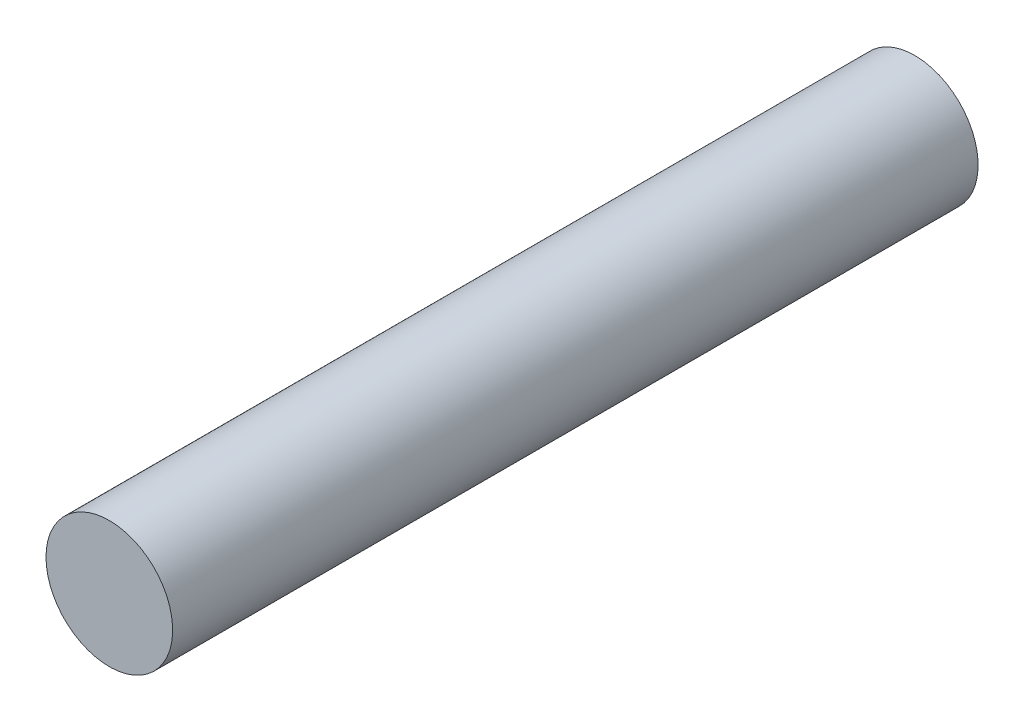
ISO-10303-21;
HEADER;
FILE_DESCRIPTION(('STEP AP214'),'2;1');
FILE_NAME('part.step','',(''),(''),'','','');
FILE_SCHEMA(('AUTOMOTIVE_DESIGN { 1 0 10303 214 1 1 1 1 }'));
ENDSEC;
DATA;
#1=APPLICATION_CONTEXT('core data for automotive mechanical design processes');
#2=APPLICATION_PROTOCOL_DEFINITION('international standard','automotive_design',2000,#1);
#3=PRODUCT_CONTEXT('',#1,'mechanical');
#4=PRODUCT('Part','Part','',(#3));
#5=PRODUCT_RELATED_PRODUCT_CATEGORY('part','',(#4));
#6=PRODUCT_DEFINITION_FORMATION('','',#4);
#7=PRODUCT_DEFINITION_CONTEXT('part definition',#1,'design');
#8=PRODUCT_DEFINITION('design','',#6,#7);
#9=PRODUCT_DEFINITION_SHAPE('','',#8);
#10=(LENGTH_UNIT() NAMED_UNIT(*) SI_UNIT(.MILLI.,.METRE.));
#11=(NAMED_UNIT(*) PLANE_ANGLE_UNIT() SI_UNIT($,.RADIAN.));
#12=(NAMED_UNIT(*) SI_UNIT($,.STERADIAN.) SOLID_ANGLE_UNIT());
#13=UNCERTAINTY_MEASURE_WITH_UNIT(LENGTH_MEASURE(1.E-05),#10,'distance_accuracy_value','');
#14=(GEOMETRIC_REPRESENTATION_CONTEXT(3) GLOBAL_UNCERTAINTY_ASSIGNED_CONTEXT((#13)) GLOBAL_UNIT_ASSIGNED_CONTEXT((#10,
#11,#12)) REPRESENTATION_CONTEXT('',''));
#15=CARTESIAN_POINT('',(0.,0.,0.));
#16=DIRECTION('',(0.,0.,1.));
#17=DIRECTION('',(1.,0.,0.));
#18=AXIS2_PLACEMENT_3D('',#15,#16,#17);
#19=CARTESIAN_POINT('',(0.,0.,159.));
#20=DIRECTION('',(0.,0.,-1.));
#21=DIRECTION('',(-1.,0.,0.));
#22=AXIS2_PLACEMENT_3D('',#19,#20,#21);
#23=CYLINDRICAL_SURFACE('',#22,12.5);
#24=CARTESIAN_POINT('',(0.,0.,159.));
#25=DIRECTION('',(0.,0.,1.));
#26=DIRECTION('',(1.,0.,0.));
#27=AXIS2_PLACEMENT_3D('',#24,#25,#26);
#28=CIRCLE('',#27,12.5);
#29=CARTESIAN_POINT('',(-12.5,0.,159.));
#30=VERTEX_POINT('',#29);
#31=EDGE_CURVE('E10',#30,#30,#28,.T.);
#32=CARTESIAN_POINT('',(0.,0.,0.));
#33=DIRECTION('',(0.,0.,1.));
#34=DIRECTION('',(1.,0.,0.));
#35=AXIS2_PLACEMENT_3D('',#32,#33,#34);
#36=CIRCLE('',#35,12.5);
#37=CARTESIAN_POINT('',(-12.5,0.,0.));
#38=VERTEX_POINT('',#37);
#39=EDGE_CURVE('E40',#38,#38,#36,.T.);
#40=CARTESIAN_POINT('',(-12.5,0.,159.));
#41=CARTESIAN_POINT('',(-12.5,0.,157.34375));
#42=CARTESIAN_POINT('',(-12.5,0.,155.6875));
#43=CARTESIAN_POINT('',(-12.5,0.,152.375));
#44=CARTESIAN_POINT('',(-12.5,0.,150.71875));
#45=CARTESIAN_POINT('',(-12.5,0.,147.40625));
#46=CARTESIAN_POINT('',(-12.5,0.,145.75));
#47=CARTESIAN_POINT('',(-12.5,0.,142.4375));
#48=CARTESIAN_POINT('',(-12.5,0.,140.78125));
#49=CARTESIAN_POINT('',(-12.5,0.,137.46875));
#50=CARTESIAN_POINT('',(-12.5,0.,135.8125));
#51=CARTESIAN_POINT('',(-12.5,0.,132.5));
#52=CARTESIAN_POINT('',(-12.5,0.,130.84375));
#53=CARTESIAN_POINT('',(-12.5,0.,127.53125));
#54=CARTESIAN_POINT('',(-12.5,0.,125.875));
#55=CARTESIAN_POINT('',(-12.5,0.,122.5625));
#56=CARTESIAN_POINT('',(-12.5,0.,120.90625));
#57=CARTESIAN_POINT('',(-12.5,0.,117.59375));
#58=CARTESIAN_POINT('',(-12.5,0.,115.9375));
#59=CARTESIAN_POINT('',(-12.5,0.,112.625));
#60=CARTESIAN_POINT('',(-12.5,0.,110.96875));
#61=CARTESIAN_POINT('',(-12.5,0.,107.65625));
#62=CARTESIAN_POINT('',(-12.5,0.,106.));
#63=CARTESIAN_POINT('',(-12.5,0.,102.6875));
#64=CARTESIAN_POINT('',(-12.5,0.,101.03125));
#65=CARTESIAN_POINT('',(-12.5,0.,97.71875));
#66=CARTESIAN_POINT('',(-12.5,0.,96.0625));
#67=CARTESIAN_POINT('',(-12.5,0.,92.75));
#68=CARTESIAN_POINT('',(-12.5,0.,91.09375));
#69=CARTESIAN_POINT('',(-12.5,0.,87.78125));
#70=CARTESIAN_POINT('',(-12.5,0.,86.125));
#71=CARTESIAN_POINT('',(-12.5,0.,82.8125));
#72=CARTESIAN_POINT('',(-12.5,0.,81.15625));
#73=CARTESIAN_POINT('',(-12.5,0.,77.84375));
#74=CARTESIAN_POINT('',(-12.5,0.,76.1875));
#75=CARTESIAN_POINT('',(-12.5,0.,72.875));
#76=CARTESIAN_POINT('',(-12.5,0.,71.21875));
#77=CARTESIAN_POINT('',(-12.5,0.,67.90625));
#78=CARTESIAN_POINT('',(-12.5,0.,66.25));
#79=CARTESIAN_POINT('',(-12.5,0.,62.9375));
#80=CARTESIAN_POINT('',(-12.5,0.,61.28125));
#81=CARTESIAN_POINT('',(-12.5,0.,57.96875));
#82=CARTESIAN_POINT('',(-12.5,0.,56.3125));
#83=CARTESIAN_POINT('',(-12.5,0.,53.));
#84=CARTESIAN_POINT('',(-12.5,0.,51.34375));
#85=CARTESIAN_POINT('',(-12.5,0.,48.03125));
#86=CARTESIAN_POINT('',(-12.5,0.,46.375));
#87=CARTESIAN_POINT('',(-12.5,0.,43.0625));
#88=CARTESIAN_POINT('',(-12.5,0.,41.40625));
#89=CARTESIAN_POINT('',(-12.5,0.,38.09375));
#90=CARTESIAN_POINT('',(-12.5,0.,36.4375));
#91=CARTESIAN_POINT('',(-12.5,0.,33.125));
#92=CARTESIAN_POINT('',(-12.5,0.,31.46875));
#93=CARTESIAN_POINT('',(-12.5,0.,28.15625));
#94=CARTESIAN_POINT('',(-12.5,0.,26.5));
#95=CARTESIAN_POINT('',(-12.5,0.,23.1875));
#96=CARTESIAN_POINT('',(-12.5,0.,21.53125));
#97=CARTESIAN_POINT('',(-12.5,0.,18.21875));
#98=CARTESIAN_POINT('',(-12.5,0.,16.5625));
#99=CARTESIAN_POINT('',(-12.5,0.,13.25));
#100=CARTESIAN_POINT('',(-12.5,0.,11.59375));
#101=CARTESIAN_POINT('',(-12.5,0.,8.28124999999999));
#102=CARTESIAN_POINT('',(-12.5,0.,6.62499999999999));
#103=CARTESIAN_POINT('',(-12.5,0.,3.3125));
#104=CARTESIAN_POINT('',(-12.5,0.,1.65625));
#105=CARTESIAN_POINT('',(-12.5,0.,0.));
#106=B_SPLINE_CURVE_WITH_KNOTS('',3,(#40,#41,#42,#43,#44,#45,#46,#47,#48,#49,#50,#51,#52,#53,
#54,#55,#56,#57,#58,#59,#60,#61,#62,#63,#64,#65,#66,#67,#68,#69,#70,#71,#72,#73,#74,#75,#76,#77,
#78,#79,#80,#81,#82,#83,#84,#85,#86,#87,#88,#89,#90,#91,#92,#93,#94,#95,#96,#97,#98,#99,#100,
#101,#102,#103,#104,#105),.UNSPECIFIED.,.F.,.F.,(4,2,2,2,2,2,2,2,2,2,2,2,2,2,2,2,2,2,2,2,2,2,2,
2,2,2,2,2,2,2,2,2,4),(0.,4.96875000000002,9.93750000000002,14.90625,19.875,24.84375,29.8125,
34.78125,39.75,44.71875,49.6875,54.65625,59.625,64.59375,69.5625,74.53125,79.5,84.46875,89.4375,
94.40625,99.375,104.34375,109.3125,114.28125,119.25,124.21875,129.1875,134.15625,139.125,
144.09375,149.0625,154.03125,159.),.UNSPECIFIED.);
#107=EDGE_CURVE('BSEAM37',#30,#38,#106,.T.);
#108=ORIENTED_EDGE('',*,*,#31,.F.);
#109=ORIENTED_EDGE('',*,*,#39,.T.);
#110=ORIENTED_EDGE('',*,*,#107,.T.);
#111=ORIENTED_EDGE('',*,*,#107,.F.);
#112=EDGE_LOOP('',(#108,#110,#109,#111));
#113=FACE_BOUND('',#112,.T.);
#114=ADVANCED_FACE('F37',(#113),#23,.T.);
#115=CARTESIAN_POINT('',(0.,0.,159.));
#116=DIRECTION('',(0.,0.,1.));
#117=DIRECTION('',(1.,0.,0.));
#118=AXIS2_PLACEMENT_3D('',#115,#116,#117);
#119=PLANE('',#118);
#120=ORIENTED_EDGE('',*,*,#31,.T.);
#121=EDGE_LOOP('',(#120));
#122=FACE_BOUND('',#121,.T.);
#123=ADVANCED_FACE('F52',(#122),#119,.T.);
#124=CARTESIAN_POINT('',(0.,0.,0.));
#125=DIRECTION('',(0.,0.,1.));
#126=DIRECTION('',(1.,0.,0.));
#127=AXIS2_PLACEMENT_3D('',#124,#125,#126);
#128=PLANE('',#127);
#129=ORIENTED_EDGE('',*,*,#39,.F.);
#130=EDGE_LOOP('',(#129));
#131=FACE_BOUND('',#130,.T.);
#132=ADVANCED_FACE('F50',(#131),#128,.F.);
#133=CLOSED_SHELL('',(#114,#123,#132));
#134=MANIFOLD_SOLID_BREP('B2',#133);
#135=ADVANCED_BREP_SHAPE_REPRESENTATION('',(#18,#134),#14);
#136=SHAPE_DEFINITION_REPRESENTATION(#9,#135);
ENDSEC;
END-ISO-10303-21;
